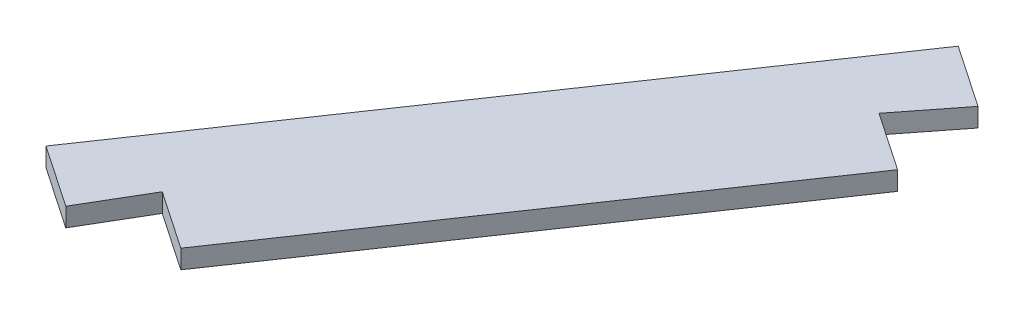
ISO-10303-21;
HEADER;
FILE_DESCRIPTION(('STEP AP214'),'2;1');
FILE_NAME('part.step','',(''),(''),'','','');
FILE_SCHEMA(('AUTOMOTIVE_DESIGN { 1 0 10303 214 1 1 1 1 }'));
ENDSEC;
DATA;
#1=APPLICATION_CONTEXT('core data for automotive mechanical design processes');
#2=APPLICATION_PROTOCOL_DEFINITION('international standard','automotive_design',2000,#1);
#3=PRODUCT_CONTEXT('',#1,'mechanical');
#4=PRODUCT('Part','Part','',(#3));
#5=PRODUCT_RELATED_PRODUCT_CATEGORY('part','',(#4));
#6=PRODUCT_DEFINITION_FORMATION('','',#4);
#7=PRODUCT_DEFINITION_CONTEXT('part definition',#1,'design');
#8=PRODUCT_DEFINITION('design','',#6,#7);
#9=PRODUCT_DEFINITION_SHAPE('','',#8);
#10=(LENGTH_UNIT() NAMED_UNIT(*) SI_UNIT(.MILLI.,.METRE.));
#11=(NAMED_UNIT(*) PLANE_ANGLE_UNIT() SI_UNIT($,.RADIAN.));
#12=(NAMED_UNIT(*) SI_UNIT($,.STERADIAN.) SOLID_ANGLE_UNIT());
#13=UNCERTAINTY_MEASURE_WITH_UNIT(LENGTH_MEASURE(1.E-05),#10,'distance_accuracy_value','');
#14=(GEOMETRIC_REPRESENTATION_CONTEXT(3) GLOBAL_UNCERTAINTY_ASSIGNED_CONTEXT((#13)) GLOBAL_UNIT_ASSIGNED_CONTEXT((#10,
#11,#12)) REPRESENTATION_CONTEXT('',''));
#15=CARTESIAN_POINT('',(0.,0.,0.));
#16=DIRECTION('',(0.,0.,1.));
#17=DIRECTION('',(1.,0.,0.));
#18=AXIS2_PLACEMENT_3D('',#15,#16,#17);
#19=CARTESIAN_POINT('',(127.113494970583,4.,-5.51496525181317));
#20=DIRECTION('',(0.563000822281161,0.,-0.826456335271705));
#21=DIRECTION('',(-0.826456335271705,0.,-0.563000822281161));
#22=AXIS2_PLACEMENT_3D('',#19,#20,#21);
#23=PLANE('',#22);
#24=DIRECTION('',(0.826456335271705,0.,0.563000822281161));
#25=VECTOR('',#24,1.);
#26=CARTESIAN_POINT('',(127.113494970583,0.,-5.51496525181317));
#27=LINE('',#26,#25);
#28=CARTESIAN_POINT('',(127.113494970583,0.,-5.51496525181317));
#29=VERTEX_POINT('',#28);
#30=CARTESIAN_POINT('',(139.510339999659,0.,2.93004708240428));
#31=VERTEX_POINT('',#30);
#32=EDGE_CURVE('E128',#29,#31,#27,.T.);
#33=ORIENTED_EDGE('',*,*,#32,.T.);
#34=DIRECTION('',(0.,-1.,0.));
#35=VECTOR('',#34,1.);
#36=CARTESIAN_POINT('',(139.510339999659,4.,2.93004708240428));
#37=LINE('',#36,#35);
#38=CARTESIAN_POINT('',(139.510339999659,4.,2.93004708240428));
#39=VERTEX_POINT('',#38);
#40=EDGE_CURVE('E11',#39,#31,#37,.T.);
#41=ORIENTED_EDGE('',*,*,#40,.F.);
#42=DIRECTION('',(0.826456335271705,0.,0.563000822281161));
#43=VECTOR('',#42,1.);
#44=CARTESIAN_POINT('',(127.113494970583,4.,-5.51496525181317));
#45=LINE('',#44,#43);
#46=CARTESIAN_POINT('',(127.113494970583,4.,-5.51496525181317));
#47=VERTEX_POINT('',#46);
#48=EDGE_CURVE('E143',#47,#39,#45,.T.);
#49=ORIENTED_EDGE('',*,*,#48,.F.);
#50=DIRECTION('',(0.,-1.,0.));
#51=VECTOR('',#50,1.);
#52=CARTESIAN_POINT('',(127.113494970583,4.,-5.51496525181317));
#53=LINE('',#52,#51);
#54=EDGE_CURVE('E124',#47,#29,#53,.T.);
#55=ORIENTED_EDGE('',*,*,#54,.T.);
#56=EDGE_LOOP('',(#33,#41,#49,#55));
#57=FACE_BOUND('',#56,.T.);
#58=ADVANCED_FACE('F33',(#57),#23,.F.);
#59=CARTESIAN_POINT('',(139.510339999659,4.,2.93004708240428));
#60=DIRECTION('',(-0.826456335271705,0.,-0.563000822281161));
#61=DIRECTION('',(-0.563000822281161,0.,0.826456335271705));
#62=AXIS2_PLACEMENT_3D('',#59,#60,#61);
#63=PLANE('',#62);
#64=DIRECTION('',(0.563000822281161,0.,-0.826456335271704));
#65=VECTOR('',#64,1.);
#66=CARTESIAN_POINT('',(139.510339999659,0.,2.93004708240428));
#67=LINE('',#66,#65);
#68=CARTESIAN_POINT('',(201.440430450586,0.,-87.9801497974832));
#69=VERTEX_POINT('',#68);
#70=EDGE_CURVE('E131',#31,#69,#67,.T.);
#71=ORIENTED_EDGE('',*,*,#70,.T.);
#72=DIRECTION('',(0.,-1.,0.));
#73=VECTOR('',#72,1.);
#74=CARTESIAN_POINT('',(201.440430450586,4.,-87.9801497974832));
#75=LINE('',#74,#73);
#76=CARTESIAN_POINT('',(201.440430450586,4.,-87.9801497974832));
#77=VERTEX_POINT('',#76);
#78=EDGE_CURVE('E41',#77,#69,#75,.T.);
#79=ORIENTED_EDGE('',*,*,#78,.F.);
#80=DIRECTION('',(0.563000822281161,0.,-0.826456335271704));
#81=VECTOR('',#80,1.);
#82=CARTESIAN_POINT('',(139.510339999659,4.,2.93004708240428));
#83=LINE('',#82,#81);
#84=EDGE_CURVE('E92',#39,#77,#83,.T.);
#85=ORIENTED_EDGE('',*,*,#84,.F.);
#86=ORIENTED_EDGE('',*,*,#40,.T.);
#87=EDGE_LOOP('',(#71,#79,#85,#86));
#88=FACE_BOUND('',#87,.T.);
#89=ADVANCED_FACE('F178',(#88),#63,.F.);
#90=CARTESIAN_POINT('',(189.043585421511,4.,-96.4251621317006));
#91=DIRECTION('',(-0.563000822281164,0.,0.826456335271703));
#92=DIRECTION('',(0.826456335271703,0.,0.563000822281164));
#93=AXIS2_PLACEMENT_3D('',#90,#91,#92);
#94=PLANE('',#93);
#95=DIRECTION('',(-0.826456335271703,0.,-0.563000822281164));
#96=VECTOR('',#95,1.);
#97=CARTESIAN_POINT('',(189.043585421511,0.,-96.4251621317006));
#98=LINE('',#97,#96);
#99=CARTESIAN_POINT('',(189.043585421511,0.,-96.4251621317006));
#100=VERTEX_POINT('',#99);
#101=EDGE_CURVE('E133',#69,#100,#98,.T.);
#102=ORIENTED_EDGE('',*,*,#101,.T.);
#103=DIRECTION('',(0.,-1.,0.));
#104=VECTOR('',#103,1.);
#105=CARTESIAN_POINT('',(189.043585421511,4.,-96.4251621317006));
#106=LINE('',#105,#104);
#107=CARTESIAN_POINT('',(189.043585421511,4.,-96.4251621317006));
#108=VERTEX_POINT('',#107);
#109=EDGE_CURVE('E150',#108,#100,#106,.T.);
#110=ORIENTED_EDGE('',*,*,#109,.F.);
#111=DIRECTION('',(-0.826456335271703,0.,-0.563000822281164));
#112=VECTOR('',#111,1.);
#113=CARTESIAN_POINT('',(189.043585421511,4.,-96.4251621317006));
#114=LINE('',#113,#112);
#115=EDGE_CURVE('E158',#77,#108,#114,.T.);
#116=ORIENTED_EDGE('',*,*,#115,.F.);
#117=ORIENTED_EDGE('',*,*,#78,.T.);
#118=EDGE_LOOP('',(#102,#110,#116,#117));
#119=FACE_BOUND('',#118,.T.);
#120=ADVANCED_FACE('F156',(#119),#94,.F.);
#121=CARTESIAN_POINT('',(198.315054091,4.,-108.259006338495));
#122=DIRECTION('',(-0.787175607328457,0.,-0.616728921996589));
#123=DIRECTION('',(-0.616728921996589,0.,0.787175607328457));
#124=AXIS2_PLACEMENT_3D('',#121,#122,#123);
#125=PLANE('',#124);
#126=DIRECTION('',(0.616728921996589,0.,-0.787175607328457));
#127=VECTOR('',#126,1.);
#128=CARTESIAN_POINT('',(198.315054091,0.,-108.259006338495));
#129=LINE('',#128,#127);
#130=CARTESIAN_POINT('',(198.315054091,0.,-108.259006338495));
#131=VERTEX_POINT('',#130);
#132=EDGE_CURVE('E135',#100,#131,#129,.T.);
#133=ORIENTED_EDGE('',*,*,#132,.T.);
#134=DIRECTION('',(0.,-1.,0.));
#135=VECTOR('',#134,1.);
#136=CARTESIAN_POINT('',(198.315054091,4.,-108.259006338495));
#137=LINE('',#136,#135);
#138=CARTESIAN_POINT('',(198.315054091,4.,-108.259006338495));
#139=VERTEX_POINT('',#138);
#140=EDGE_CURVE('E147',#139,#131,#137,.T.);
#141=ORIENTED_EDGE('',*,*,#140,.F.);
#142=DIRECTION('',(0.616728921996589,0.,-0.787175607328457));
#143=VECTOR('',#142,1.);
#144=CARTESIAN_POINT('',(198.315054091,4.,-108.259006338495));
#145=LINE('',#144,#143);
#146=EDGE_CURVE('E170',#108,#139,#145,.T.);
#147=ORIENTED_EDGE('',*,*,#146,.F.);
#148=ORIENTED_EDGE('',*,*,#109,.T.);
#149=EDGE_LOOP('',(#133,#141,#147,#148));
#150=FACE_BOUND('',#149,.T.);
#151=ADVANCED_FACE('F166',(#150),#125,.F.);
#152=CARTESIAN_POINT('',(185.091752726653,4.,-117.267019494994));
#153=DIRECTION('',(-0.563000822281162,0.,0.826456335271704));
#154=DIRECTION('',(0.826456335271704,0.,0.563000822281162));
#155=AXIS2_PLACEMENT_3D('',#152,#153,#154);
#156=PLANE('',#155);
#157=DIRECTION('',(-0.826456335271704,0.,-0.563000822281162));
#158=VECTOR('',#157,1.);
#159=CARTESIAN_POINT('',(185.091752726653,0.,-117.267019494994));
#160=LINE('',#159,#158);
#161=CARTESIAN_POINT('',(185.091752726653,0.,-117.267019494994));
#162=VERTEX_POINT('',#161);
#163=EDGE_CURVE('E137',#131,#162,#160,.T.);
#164=ORIENTED_EDGE('',*,*,#163,.T.);
#165=DIRECTION('',(0.,-1.,0.));
#166=VECTOR('',#165,1.);
#167=CARTESIAN_POINT('',(185.091752726653,4.,-117.267019494994));
#168=LINE('',#167,#166);
#169=CARTESIAN_POINT('',(185.091752726653,4.,-117.267019494994));
#170=VERTEX_POINT('',#169);
#171=EDGE_CURVE('E119',#170,#162,#168,.T.);
#172=ORIENTED_EDGE('',*,*,#171,.F.);
#173=DIRECTION('',(-0.826456335271704,0.,-0.563000822281162));
#174=VECTOR('',#173,1.);
#175=CARTESIAN_POINT('',(185.091752726653,4.,-117.267019494994));
#176=LINE('',#175,#174);
#177=EDGE_CURVE('E111',#139,#170,#176,.T.);
#178=ORIENTED_EDGE('',*,*,#177,.F.);
#179=ORIENTED_EDGE('',*,*,#140,.T.);
#180=EDGE_LOOP('',(#164,#172,#178,#179));
#181=FACE_BOUND('',#180,.T.);
#182=ADVANCED_FACE('F169',(#181),#156,.F.);
#183=CARTESIAN_POINT('',(114.716649941507,4.,-13.9599775860306));
#184=DIRECTION('',(0.826456335271704,0.,0.563000822281162));
#185=DIRECTION('',(0.563000822281162,0.,-0.826456335271704));
#186=AXIS2_PLACEMENT_3D('',#183,#184,#185);
#187=PLANE('',#186);
#188=DIRECTION('',(-0.563000822281162,0.,0.826456335271704));
#189=VECTOR('',#188,1.);
#190=CARTESIAN_POINT('',(114.716649941507,0.,-13.9599775860306));
#191=LINE('',#190,#189);
#192=CARTESIAN_POINT('',(106.27163760729,0.,-1.56313255695503));
#193=VERTEX_POINT('',#192);
#194=EDGE_CURVE('E118',#162,#193,#191,.T.);
#195=ORIENTED_EDGE('',*,*,#194,.T.);
#196=DIRECTION('',(0.,-1.,0.));
#197=VECTOR('',#196,1.);
#198=CARTESIAN_POINT('',(106.27163760729,4.,-1.56313255695503));
#199=LINE('',#198,#197);
#200=CARTESIAN_POINT('',(106.27163760729,4.,-1.56313255695503));
#201=VERTEX_POINT('',#200);
#202=EDGE_CURVE('E116',#201,#193,#199,.T.);
#203=ORIENTED_EDGE('',*,*,#202,.F.);
#204=DIRECTION('',(-0.563000822281166,0.,0.826456335271701));
#205=VECTOR('',#204,1.);
#206=CARTESIAN_POINT('',(176.646740392435,4.,-104.870174465918));
#207=LINE('',#206,#205);
#208=EDGE_CURVE('E105',#170,#201,#207,.T.);
#209=ORIENTED_EDGE('',*,*,#208,.F.);
#210=ORIENTED_EDGE('',*,*,#171,.T.);
#211=EDGE_LOOP('',(#195,#203,#209,#210));
#212=FACE_BOUND('',#211,.T.);
#213=ADVANCED_FACE('F117',(#212),#187,.F.);
#214=CARTESIAN_POINT('',(106.27163760729,4.,-1.56313255695503));
#215=DIRECTION('',(0.563000822281162,0.,-0.826456335271704));
#216=DIRECTION('',(-0.826456335271704,0.,-0.563000822281162));
#217=AXIS2_PLACEMENT_3D('',#214,#215,#216);
#218=PLANE('',#217);
#219=DIRECTION('',(0.826456335271704,0.,0.563000822281162));
#220=VECTOR('',#219,1.);
#221=CARTESIAN_POINT('',(106.27163760729,0.,-1.56313255695503));
#222=LINE('',#221,#220);
#223=CARTESIAN_POINT('',(119.494938971637,0.,7.44488059954357));
#224=VERTEX_POINT('',#223);
#225=EDGE_CURVE('E78',#193,#224,#222,.T.);
#226=ORIENTED_EDGE('',*,*,#225,.T.);
#227=DIRECTION('',(0.,-1.,0.));
#228=VECTOR('',#227,1.);
#229=CARTESIAN_POINT('',(119.494938971637,4.,7.44488059954357));
#230=LINE('',#229,#228);
#231=CARTESIAN_POINT('',(119.494938971637,4.,7.44488059954357));
#232=VERTEX_POINT('',#231);
#233=EDGE_CURVE('E120',#232,#224,#230,.T.);
#234=ORIENTED_EDGE('',*,*,#233,.F.);
#235=DIRECTION('',(0.826456335271704,0.,0.563000822281162));
#236=VECTOR('',#235,1.);
#237=CARTESIAN_POINT('',(106.27163760729,4.,-1.56313255695503));
#238=LINE('',#237,#236);
#239=EDGE_CURVE('E109',#201,#232,#238,.T.);
#240=ORIENTED_EDGE('',*,*,#239,.F.);
#241=ORIENTED_EDGE('',*,*,#202,.T.);
#242=EDGE_LOOP('',(#226,#234,#240,#241));
#243=FACE_BOUND('',#242,.T.);
#244=ADVANCED_FACE('F122',(#243),#218,.F.);
#245=CARTESIAN_POINT('',(119.494938971637,4.,7.44488059954357));
#246=DIRECTION('',(-0.862076122572886,0.,-0.506778806669832));
#247=DIRECTION('',(-0.506778806669832,0.,0.862076122572886));
#248=AXIS2_PLACEMENT_3D('',#245,#246,#247);
#249=PLANE('',#248);
#250=DIRECTION('',(0.506778806669832,0.,-0.862076122572886));
#251=VECTOR('',#250,1.);
#252=CARTESIAN_POINT('',(119.494938971637,0.,7.44488059954357));
#253=LINE('',#252,#251);
#254=EDGE_CURVE('E84',#224,#29,#253,.T.);
#255=ORIENTED_EDGE('',*,*,#254,.T.);
#256=ORIENTED_EDGE('',*,*,#54,.F.);
#257=DIRECTION('',(0.506778806669832,0.,-0.862076122572886));
#258=VECTOR('',#257,1.);
#259=CARTESIAN_POINT('',(119.494938971637,4.,7.44488059954357));
#260=LINE('',#259,#258);
#261=EDGE_CURVE('E49',#232,#47,#260,.T.);
#262=ORIENTED_EDGE('',*,*,#261,.F.);
#263=ORIENTED_EDGE('',*,*,#233,.T.);
#264=EDGE_LOOP('',(#255,#256,#262,#263));
#265=FACE_BOUND('',#264,.T.);
#266=ADVANCED_FACE('F194',(#265),#249,.F.);
#267=CARTESIAN_POINT('',(0.,4.,0.));
#268=DIRECTION('',(0.,1.,0.));
#269=DIRECTION('',(0.,0.,1.));
#270=AXIS2_PLACEMENT_3D('',#267,#268,#269);
#271=PLANE('',#270);
#272=ORIENTED_EDGE('',*,*,#48,.T.);
#273=ORIENTED_EDGE('',*,*,#84,.T.);
#274=ORIENTED_EDGE('',*,*,#115,.T.);
#275=ORIENTED_EDGE('',*,*,#146,.T.);
#276=ORIENTED_EDGE('',*,*,#177,.T.);
#277=ORIENTED_EDGE('',*,*,#208,.T.);
#278=ORIENTED_EDGE('',*,*,#239,.T.);
#279=ORIENTED_EDGE('',*,*,#261,.T.);
#280=EDGE_LOOP('',(#272,#273,#274,#275,#276,#277,#278,#279));
#281=FACE_BOUND('',#280,.T.);
#282=ADVANCED_FACE('F107',(#281),#271,.T.);
#283=CARTESIAN_POINT('',(0.,0.,0.));
#284=DIRECTION('',(0.,1.,0.));
#285=DIRECTION('',(0.,0.,1.));
#286=AXIS2_PLACEMENT_3D('',#283,#284,#285);
#287=PLANE('',#286);
#288=ORIENTED_EDGE('',*,*,#32,.F.);
#289=ORIENTED_EDGE('',*,*,#254,.F.);
#290=ORIENTED_EDGE('',*,*,#225,.F.);
#291=ORIENTED_EDGE('',*,*,#194,.F.);
#292=ORIENTED_EDGE('',*,*,#163,.F.);
#293=ORIENTED_EDGE('',*,*,#132,.F.);
#294=ORIENTED_EDGE('',*,*,#101,.F.);
#295=ORIENTED_EDGE('',*,*,#70,.F.);
#296=EDGE_LOOP('',(#288,#289,#290,#291,#292,#293,#294,#295));
#297=FACE_BOUND('',#296,.T.);
#298=ADVANCED_FACE('F162',(#297),#287,.F.);
#299=CLOSED_SHELL('',(#58,#89,#120,#151,#182,#213,#244,#266,#282,#298));
#300=MANIFOLD_SOLID_BREP('B2',#299);
#301=ADVANCED_BREP_SHAPE_REPRESENTATION('',(#18,#300),#14);
#302=SHAPE_DEFINITION_REPRESENTATION(#9,#301);
ENDSEC;
END-ISO-10303-21;
